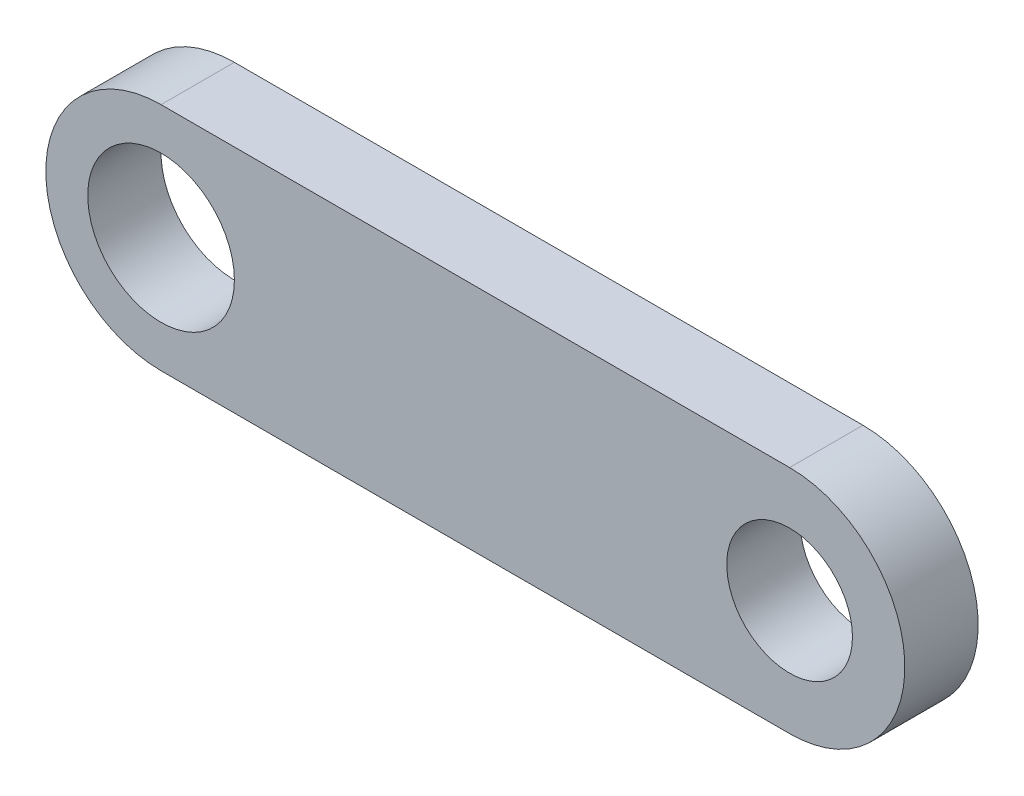
ISO-10303-21;
HEADER;
FILE_DESCRIPTION(('STEP AP214'),'2;1');
FILE_NAME('part.step','',(''),(''),'','','');
FILE_SCHEMA(('AUTOMOTIVE_DESIGN { 1 0 10303 214 1 1 1 1 }'));
ENDSEC;
DATA;
#1=APPLICATION_CONTEXT('core data for automotive mechanical design processes');
#2=APPLICATION_PROTOCOL_DEFINITION('international standard','automotive_design',2000,#1);
#3=PRODUCT_CONTEXT('',#1,'mechanical');
#4=PRODUCT('Part','Part','',(#3));
#5=PRODUCT_RELATED_PRODUCT_CATEGORY('part','',(#4));
#6=PRODUCT_DEFINITION_FORMATION('','',#4);
#7=PRODUCT_DEFINITION_CONTEXT('part definition',#1,'design');
#8=PRODUCT_DEFINITION('design','',#6,#7);
#9=PRODUCT_DEFINITION_SHAPE('','',#8);
#10=(LENGTH_UNIT() NAMED_UNIT(*) SI_UNIT(.MILLI.,.METRE.));
#11=(NAMED_UNIT(*) PLANE_ANGLE_UNIT() SI_UNIT($,.RADIAN.));
#12=(NAMED_UNIT(*) SI_UNIT($,.STERADIAN.) SOLID_ANGLE_UNIT());
#13=UNCERTAINTY_MEASURE_WITH_UNIT(LENGTH_MEASURE(1.E-05),#10,'distance_accuracy_value','');
#14=(GEOMETRIC_REPRESENTATION_CONTEXT(3) GLOBAL_UNCERTAINTY_ASSIGNED_CONTEXT((#13)) GLOBAL_UNIT_ASSIGNED_CONTEXT((#10,
#11,#12)) REPRESENTATION_CONTEXT('',''));
#15=CARTESIAN_POINT('',(0.,0.,0.));
#16=DIRECTION('',(0.,0.,1.));
#17=DIRECTION('',(1.,0.,0.));
#18=AXIS2_PLACEMENT_3D('',#15,#16,#17);
#19=CARTESIAN_POINT('',(0.,0.,3.5));
#20=DIRECTION('',(0.,0.,1.));
#21=DIRECTION('',(1.,0.,0.));
#22=AXIS2_PLACEMENT_3D('',#19,#20,#21);
#23=PLANE('',#22);
#24=CARTESIAN_POINT('',(0.,0.,3.5));
#25=DIRECTION('',(0.,0.,1.));
#26=DIRECTION('',(1.,0.,0.));
#27=AXIS2_PLACEMENT_3D('',#24,#25,#26);
#28=CIRCLE('',#27,3.5);
#29=CARTESIAN_POINT('',(3.5,0.,3.5));
#30=VERTEX_POINT('',#29);
#31=EDGE_CURVE('E107',#30,#30,#28,.T.);
#32=ORIENTED_EDGE('',*,*,#31,.F.);
#33=EDGE_LOOP('',(#32));
#34=FACE_BOUND('',#33,.T.);
#35=CARTESIAN_POINT('',(0.,0.,3.5));
#36=DIRECTION('',(0.,0.,1.));
#37=DIRECTION('',(1.,0.,0.));
#38=AXIS2_PLACEMENT_3D('',#35,#36,#37);
#39=CIRCLE('',#38,5.5);
#40=CARTESIAN_POINT('',(0.,5.5,3.5));
#41=VERTEX_POINT('',#40);
#42=CARTESIAN_POINT('',(0.,-5.5,3.5));
#43=VERTEX_POINT('',#42);
#44=EDGE_CURVE('E92',#41,#43,#39,.T.);
#45=ORIENTED_EDGE('',*,*,#44,.T.);
#46=DIRECTION('',(1.,0.,0.));
#47=VECTOR('',#46,1.);
#48=CARTESIAN_POINT('',(0.,-5.5,3.5));
#49=LINE('',#48,#47);
#50=CARTESIAN_POINT('',(30.,-5.5,3.5));
#51=VERTEX_POINT('',#50);
#52=EDGE_CURVE('E87',#43,#51,#49,.T.);
#53=ORIENTED_EDGE('',*,*,#52,.T.);
#54=CARTESIAN_POINT('',(30.,0.,3.5));
#55=DIRECTION('',(0.,0.,1.));
#56=DIRECTION('',(1.,0.,0.));
#57=AXIS2_PLACEMENT_3D('',#54,#55,#56);
#58=CIRCLE('',#57,5.5);
#59=CARTESIAN_POINT('',(30.,5.5,3.5));
#60=VERTEX_POINT('',#59);
#61=EDGE_CURVE('E90',#51,#60,#58,.T.);
#62=ORIENTED_EDGE('',*,*,#61,.T.);
#63=DIRECTION('',(-1.,0.,0.));
#64=VECTOR('',#63,1.);
#65=CARTESIAN_POINT('',(0.,5.5,3.5));
#66=LINE('',#65,#64);
#67=EDGE_CURVE('E57',#60,#41,#66,.T.);
#68=ORIENTED_EDGE('',*,*,#67,.T.);
#69=EDGE_LOOP('',(#45,#53,#62,#68));
#70=FACE_BOUND('',#69,.T.);
#71=CARTESIAN_POINT('',(30.,0.,3.5));
#72=DIRECTION('',(0.,0.,1.));
#73=DIRECTION('',(1.,0.,0.));
#74=AXIS2_PLACEMENT_3D('',#71,#72,#73);
#75=CIRCLE('',#74,3.);
#76=CARTESIAN_POINT('',(33.,0.,3.5));
#77=VERTEX_POINT('',#76);
#78=EDGE_CURVE('E122',#77,#77,#75,.T.);
#79=ORIENTED_EDGE('',*,*,#78,.F.);
#80=EDGE_LOOP('',(#79));
#81=FACE_BOUND('',#80,.T.);
#82=ADVANCED_FACE('F40',(#34,#70,#81),#23,.T.);
#83=CARTESIAN_POINT('',(0.,0.,0.));
#84=DIRECTION('',(0.,0.,1.));
#85=DIRECTION('',(1.,0.,0.));
#86=AXIS2_PLACEMENT_3D('',#83,#84,#85);
#87=PLANE('',#86);
#88=CARTESIAN_POINT('',(0.,0.,0.));
#89=DIRECTION('',(0.,0.,1.));
#90=DIRECTION('',(1.,0.,0.));
#91=AXIS2_PLACEMENT_3D('',#88,#89,#90);
#92=CIRCLE('',#91,5.5);
#93=CARTESIAN_POINT('',(0.,5.5,0.));
#94=VERTEX_POINT('',#93);
#95=CARTESIAN_POINT('',(0.,-5.5,0.));
#96=VERTEX_POINT('',#95);
#97=EDGE_CURVE('E104',#94,#96,#92,.T.);
#98=ORIENTED_EDGE('',*,*,#97,.F.);
#99=DIRECTION('',(-1.,0.,0.));
#100=VECTOR('',#99,1.);
#101=CARTESIAN_POINT('',(0.,5.5,0.));
#102=LINE('',#101,#100);
#103=CARTESIAN_POINT('',(30.,5.5,0.));
#104=VERTEX_POINT('',#103);
#105=EDGE_CURVE('E80',#104,#94,#102,.T.);
#106=ORIENTED_EDGE('',*,*,#105,.F.);
#107=CARTESIAN_POINT('',(30.,0.,0.));
#108=DIRECTION('',(0.,0.,1.));
#109=DIRECTION('',(1.,0.,0.));
#110=AXIS2_PLACEMENT_3D('',#107,#108,#109);
#111=CIRCLE('',#110,5.5);
#112=CARTESIAN_POINT('',(30.,-5.5,0.));
#113=VERTEX_POINT('',#112);
#114=EDGE_CURVE('E74',#113,#104,#111,.T.);
#115=ORIENTED_EDGE('',*,*,#114,.F.);
#116=DIRECTION('',(1.,0.,0.));
#117=VECTOR('',#116,1.);
#118=CARTESIAN_POINT('',(0.,-5.5,0.));
#119=LINE('',#118,#117);
#120=EDGE_CURVE('E96',#96,#113,#119,.T.);
#121=ORIENTED_EDGE('',*,*,#120,.F.);
#122=EDGE_LOOP('',(#98,#106,#115,#121));
#123=FACE_BOUND('',#122,.T.);
#124=CARTESIAN_POINT('',(0.,0.,0.));
#125=DIRECTION('',(0.,0.,1.));
#126=DIRECTION('',(1.,0.,0.));
#127=AXIS2_PLACEMENT_3D('',#124,#125,#126);
#128=CIRCLE('',#127,3.5);
#129=CARTESIAN_POINT('',(3.5,0.,0.));
#130=VERTEX_POINT('',#129);
#131=EDGE_CURVE('E119',#130,#130,#128,.T.);
#132=ORIENTED_EDGE('',*,*,#131,.T.);
#133=EDGE_LOOP('',(#132));
#134=FACE_BOUND('',#133,.T.);
#135=CARTESIAN_POINT('',(30.,0.,0.));
#136=DIRECTION('',(0.,0.,1.));
#137=DIRECTION('',(1.,0.,0.));
#138=AXIS2_PLACEMENT_3D('',#135,#136,#137);
#139=CIRCLE('',#138,3.);
#140=CARTESIAN_POINT('',(33.,0.,0.));
#141=VERTEX_POINT('',#140);
#142=EDGE_CURVE('E125',#141,#141,#139,.T.);
#143=ORIENTED_EDGE('',*,*,#142,.T.);
#144=EDGE_LOOP('',(#143));
#145=FACE_BOUND('',#144,.T.);
#146=ADVANCED_FACE('F115',(#123,#134,#145),#87,.F.);
#147=CARTESIAN_POINT('',(0.,0.,3.5));
#148=DIRECTION('',(0.,0.,-1.));
#149=DIRECTION('',(-1.,0.,0.));
#150=AXIS2_PLACEMENT_3D('',#147,#148,#149);
#151=CYLINDRICAL_SURFACE('',#150,5.5);
#152=ORIENTED_EDGE('',*,*,#97,.T.);
#153=DIRECTION('',(0.,0.,-1.));
#154=VECTOR('',#153,1.);
#155=CARTESIAN_POINT('',(0.,-5.5,3.5));
#156=LINE('',#155,#154);
#157=EDGE_CURVE('E11',#43,#96,#156,.T.);
#158=ORIENTED_EDGE('',*,*,#157,.F.);
#159=ORIENTED_EDGE('',*,*,#44,.F.);
#160=DIRECTION('',(0.,0.,-1.));
#161=VECTOR('',#160,1.);
#162=CARTESIAN_POINT('',(0.,5.5,3.5));
#163=LINE('',#162,#161);
#164=EDGE_CURVE('E100',#41,#94,#163,.T.);
#165=ORIENTED_EDGE('',*,*,#164,.T.);
#166=EDGE_LOOP('',(#152,#158,#159,#165));
#167=FACE_BOUND('',#166,.T.);
#168=ADVANCED_FACE('F42',(#167),#151,.T.);
#169=CARTESIAN_POINT('',(0.,-5.5,3.5));
#170=DIRECTION('',(0.,1.,0.));
#171=DIRECTION('',(-1.,0.,0.));
#172=AXIS2_PLACEMENT_3D('',#169,#170,#171);
#173=PLANE('',#172);
#174=ORIENTED_EDGE('',*,*,#120,.T.);
#175=DIRECTION('',(0.,0.,-1.));
#176=VECTOR('',#175,1.);
#177=CARTESIAN_POINT('',(30.,-5.5,3.5));
#178=LINE('',#177,#176);
#179=EDGE_CURVE('E49',#51,#113,#178,.T.);
#180=ORIENTED_EDGE('',*,*,#179,.F.);
#181=ORIENTED_EDGE('',*,*,#52,.F.);
#182=ORIENTED_EDGE('',*,*,#157,.T.);
#183=EDGE_LOOP('',(#174,#180,#181,#182));
#184=FACE_BOUND('',#183,.T.);
#185=ADVANCED_FACE('F95',(#184),#173,.F.);
#186=CARTESIAN_POINT('',(30.,0.,3.5));
#187=DIRECTION('',(0.,0.,-1.));
#188=DIRECTION('',(-1.,0.,0.));
#189=AXIS2_PLACEMENT_3D('',#186,#187,#188);
#190=CYLINDRICAL_SURFACE('',#189,5.5);
#191=ORIENTED_EDGE('',*,*,#114,.T.);
#192=DIRECTION('',(0.,0.,-1.));
#193=VECTOR('',#192,1.);
#194=CARTESIAN_POINT('',(30.,5.5,3.5));
#195=LINE('',#194,#193);
#196=EDGE_CURVE('E97',#60,#104,#195,.T.);
#197=ORIENTED_EDGE('',*,*,#196,.F.);
#198=ORIENTED_EDGE('',*,*,#61,.F.);
#199=ORIENTED_EDGE('',*,*,#179,.T.);
#200=EDGE_LOOP('',(#191,#197,#198,#199));
#201=FACE_BOUND('',#200,.T.);
#202=ADVANCED_FACE('F98',(#201),#190,.T.);
#203=CARTESIAN_POINT('',(0.,5.5,3.5));
#204=DIRECTION('',(0.,-1.,0.));
#205=DIRECTION('',(1.,0.,0.));
#206=AXIS2_PLACEMENT_3D('',#203,#204,#205);
#207=PLANE('',#206);
#208=ORIENTED_EDGE('',*,*,#105,.T.);
#209=ORIENTED_EDGE('',*,*,#164,.F.);
#210=ORIENTED_EDGE('',*,*,#67,.F.);
#211=ORIENTED_EDGE('',*,*,#196,.T.);
#212=EDGE_LOOP('',(#208,#209,#210,#211));
#213=FACE_BOUND('',#212,.T.);
#214=ADVANCED_FACE('F112',(#213),#207,.F.);
#215=CARTESIAN_POINT('',(0.,0.,3.5));
#216=DIRECTION('',(0.,0.,-1.));
#217=DIRECTION('',(-1.,0.,0.));
#218=AXIS2_PLACEMENT_3D('',#215,#216,#217);
#219=CYLINDRICAL_SURFACE('',#218,3.5);
#220=ORIENTED_EDGE('',*,*,#31,.T.);
#221=EDGE_LOOP('',(#220));
#222=FACE_BOUND('',#221,.T.);
#223=ORIENTED_EDGE('',*,*,#131,.F.);
#224=EDGE_LOOP('',(#223));
#225=FACE_BOUND('',#224,.T.);
#226=ADVANCED_FACE('F142',(#222,#225),#219,.F.);
#227=CARTESIAN_POINT('',(30.,0.,3.5));
#228=DIRECTION('',(0.,0.,-1.));
#229=DIRECTION('',(-1.,0.,0.));
#230=AXIS2_PLACEMENT_3D('',#227,#228,#229);
#231=CYLINDRICAL_SURFACE('',#230,3.);
#232=ORIENTED_EDGE('',*,*,#78,.T.);
#233=EDGE_LOOP('',(#232));
#234=FACE_BOUND('',#233,.T.);
#235=ORIENTED_EDGE('',*,*,#142,.F.);
#236=EDGE_LOOP('',(#235));
#237=FACE_BOUND('',#236,.T.);
#238=ADVANCED_FACE('F131',(#234,#237),#231,.F.);
#239=CLOSED_SHELL('',(#82,#146,#168,#185,#202,#214,#226,#238));
#240=MANIFOLD_SOLID_BREP('B2',#239);
#241=ADVANCED_BREP_SHAPE_REPRESENTATION('',(#18,#240),#14);
#242=SHAPE_DEFINITION_REPRESENTATION(#9,#241);
ENDSEC;
END-ISO-10303-21;
